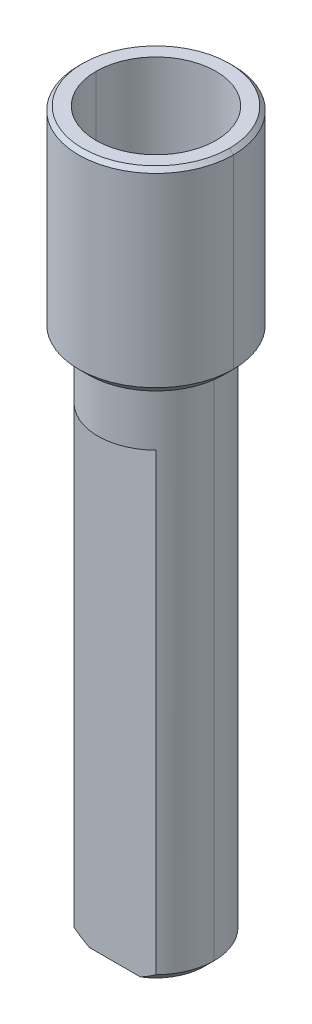
ISO-10303-21;
HEADER;
FILE_DESCRIPTION(('STEP AP214'),'2;1');
FILE_NAME('part.step','',(''),(''),'','','');
FILE_SCHEMA(('AUTOMOTIVE_DESIGN { 1 0 10303 214 1 1 1 1 }'));
ENDSEC;
DATA;
#1=APPLICATION_CONTEXT('core data for automotive mechanical design processes');
#2=APPLICATION_PROTOCOL_DEFINITION('international standard','automotive_design',2000,#1);
#3=PRODUCT_CONTEXT('',#1,'mechanical');
#4=PRODUCT('Part','Part','',(#3));
#5=PRODUCT_RELATED_PRODUCT_CATEGORY('part','',(#4));
#6=PRODUCT_DEFINITION_FORMATION('','',#4);
#7=PRODUCT_DEFINITION_CONTEXT('part definition',#1,'design');
#8=PRODUCT_DEFINITION('design','',#6,#7);
#9=PRODUCT_DEFINITION_SHAPE('','',#8);
#10=(LENGTH_UNIT() NAMED_UNIT(*) SI_UNIT(.MILLI.,.METRE.));
#11=(NAMED_UNIT(*) PLANE_ANGLE_UNIT() SI_UNIT($,.RADIAN.));
#12=(NAMED_UNIT(*) SI_UNIT($,.STERADIAN.) SOLID_ANGLE_UNIT());
#13=UNCERTAINTY_MEASURE_WITH_UNIT(LENGTH_MEASURE(1.E-05),#10,'distance_accuracy_value','');
#14=(GEOMETRIC_REPRESENTATION_CONTEXT(3) GLOBAL_UNCERTAINTY_ASSIGNED_CONTEXT((#13)) GLOBAL_UNIT_ASSIGNED_CONTEXT((#10,
#11,#12)) REPRESENTATION_CONTEXT('',''));
#15=CARTESIAN_POINT('',(0.,0.,0.));
#16=DIRECTION('',(0.,0.,1.));
#17=DIRECTION('',(1.,0.,0.));
#18=AXIS2_PLACEMENT_3D('',#15,#16,#17);
#19=CARTESIAN_POINT('',(0.,10.3,0.));
#20=DIRECTION('',(0.,-1.,0.));
#21=DIRECTION('',(0.,0.,-1.));
#22=AXIS2_PLACEMENT_3D('',#19,#20,#21);
#23=PLANE('',#22);
#24=CARTESIAN_POINT('',(0.,10.3,0.));
#25=DIRECTION('',(0.,-1.,0.));
#26=DIRECTION('',(0.,0.,-1.));
#27=AXIS2_PLACEMENT_3D('',#24,#25,#26);
#28=CIRCLE('',#27,3.1);
#29=CARTESIAN_POINT('',(-3.1,10.3,0.));
#30=VERTEX_POINT('',#29);
#31=CARTESIAN_POINT('',(3.1,10.3,0.));
#32=VERTEX_POINT('',#31);
#33=EDGE_CURVE('E115',#30,#32,#28,.T.);
#34=ORIENTED_EDGE('',*,*,#33,.T.);
#35=CARTESIAN_POINT('',(0.,10.3,0.));
#36=DIRECTION('',(0.,-1.,0.));
#37=DIRECTION('',(0.,0.,-1.));
#38=AXIS2_PLACEMENT_3D('',#35,#36,#37);
#39=CIRCLE('',#38,3.1);
#40=EDGE_CURVE('E20',#32,#30,#39,.T.);
#41=ORIENTED_EDGE('',*,*,#40,.T.);
#42=EDGE_LOOP('',(#34,#41));
#43=FACE_BOUND('',#42,.T.);
#44=CARTESIAN_POINT('',(0.,10.2999999999724,0.));
#45=DIRECTION('',(0.,-1.,0.));
#46=DIRECTION('',(0.,0.,-1.));
#47=AXIS2_PLACEMENT_3D('',#44,#45,#46);
#48=CIRCLE('',#47,3.80000000001246);
#49=CARTESIAN_POINT('',(3.80000000001247,10.2999999999724,0.));
#50=VERTEX_POINT('',#49);
#51=CARTESIAN_POINT('',(-3.80000000001245,10.2999999999724,0.));
#52=VERTEX_POINT('',#51);
#53=EDGE_CURVE('E137',#50,#52,#48,.T.);
#54=ORIENTED_EDGE('',*,*,#53,.F.);
#55=CARTESIAN_POINT('',(0.,10.2999999999724,0.));
#56=DIRECTION('',(0.,-1.,0.));
#57=DIRECTION('',(0.,0.,-1.));
#58=AXIS2_PLACEMENT_3D('',#55,#56,#57);
#59=CIRCLE('',#58,3.80000000001246);
#60=EDGE_CURVE('E132',#52,#50,#59,.T.);
#61=ORIENTED_EDGE('',*,*,#60,.F.);
#62=EDGE_LOOP('',(#54,#61));
#63=FACE_BOUND('',#62,.T.);
#64=ADVANCED_FACE('F17',(#43,#63),#23,.F.);
#65=CARTESIAN_POINT('',(0.,12.165,0.));
#66=DIRECTION('',(0.,-1.,0.));
#67=DIRECTION('',(0.,0.,-1.));
#68=AXIS2_PLACEMENT_3D('',#65,#66,#67);
#69=CYLINDRICAL_SURFACE('',#68,3.1);
#70=DIRECTION('',(0.,-1.,0.));
#71=VECTOR('',#70,1.);
#72=CARTESIAN_POINT('',(3.1,12.165,0.));
#73=LINE('',#72,#71);
#74=CARTESIAN_POINT('',(3.1,2.3,0.));
#75=VERTEX_POINT('',#74);
#76=EDGE_CURVE('E131',#32,#75,#73,.T.);
#77=ORIENTED_EDGE('',*,*,#76,.T.);
#78=CARTESIAN_POINT('',(0.,2.3,0.));
#79=DIRECTION('',(0.,-1.,0.));
#80=DIRECTION('',(0.,0.,-1.));
#81=AXIS2_PLACEMENT_3D('',#78,#79,#80);
#82=CIRCLE('',#81,3.1);
#83=CARTESIAN_POINT('',(-3.1,2.3,0.));
#84=VERTEX_POINT('',#83);
#85=EDGE_CURVE('E125',#75,#84,#82,.T.);
#86=ORIENTED_EDGE('',*,*,#85,.T.);
#87=DIRECTION('',(0.,-1.,0.));
#88=VECTOR('',#87,1.);
#89=CARTESIAN_POINT('',(-3.1,12.165,0.));
#90=LINE('',#89,#88);
#91=EDGE_CURVE('E121',#84,#30,#90,.F.);
#92=ORIENTED_EDGE('',*,*,#91,.T.);
#93=ORIENTED_EDGE('',*,*,#40,.F.);
#94=EDGE_LOOP('',(#77,#86,#92,#93));
#95=FACE_BOUND('',#94,.T.);
#96=ADVANCED_FACE('F123',(#95),#69,.F.);
#97=CARTESIAN_POINT('',(0.,12.165,0.));
#98=DIRECTION('',(0.,-1.,0.));
#99=DIRECTION('',(0.,0.,-1.));
#100=AXIS2_PLACEMENT_3D('',#97,#98,#99);
#101=CYLINDRICAL_SURFACE('',#100,3.1);
#102=ORIENTED_EDGE('',*,*,#76,.F.);
#103=ORIENTED_EDGE('',*,*,#33,.F.);
#104=ORIENTED_EDGE('',*,*,#91,.F.);
#105=CARTESIAN_POINT('',(0.,2.3,0.));
#106=DIRECTION('',(0.,-1.,0.));
#107=DIRECTION('',(0.,0.,-1.));
#108=AXIS2_PLACEMENT_3D('',#105,#106,#107);
#109=CIRCLE('',#108,3.1);
#110=EDGE_CURVE('E142',#84,#75,#109,.T.);
#111=ORIENTED_EDGE('',*,*,#110,.T.);
#112=EDGE_LOOP('',(#102,#103,#104,#111));
#113=FACE_BOUND('',#112,.T.);
#114=ADVANCED_FACE('F130',(#113),#101,.F.);
#115=CARTESIAN_POINT('',(0.,10.1000000000795,0.));
#116=DIRECTION('',(0.,-1.,0.));
#117=DIRECTION('',(0.,0.,-1.));
#118=AXIS2_PLACEMENT_3D('',#115,#116,#117);
#119=CONICAL_SURFACE('',#118,3.99999999990542,0.785398163397448);
#120=DIRECTION('',(-0.707106781186443,0.707106781186652,0.));
#121=VECTOR('',#120,1.);
#122=CARTESIAN_POINT('',(499000.,-498985.900000148,-3.05539285278683E-11));
#123=LINE('',#122,#121);
#124=CARTESIAN_POINT('',(3.99999999999056,10.1000000000057,0.));
#125=VERTEX_POINT('',#124);
#126=EDGE_CURVE('E136',#125,#50,#123,.T.);
#127=ORIENTED_EDGE('',*,*,#126,.F.);
#128=CARTESIAN_POINT('',(0.,10.1,0.));
#129=DIRECTION('',(0.,-1.,0.));
#130=DIRECTION('',(0.,0.,-1.));
#131=AXIS2_PLACEMENT_3D('',#128,#129,#130);
#132=CIRCLE('',#131,4.);
#133=CARTESIAN_POINT('',(-3.99999999999056,10.1000000000057,0.));
#134=VERTEX_POINT('',#133);
#135=EDGE_CURVE('E144',#134,#125,#132,.T.);
#136=ORIENTED_EDGE('',*,*,#135,.F.);
#137=DIRECTION('',(0.707106781186443,0.707106781186652,0.));
#138=VECTOR('',#137,1.);
#139=CARTESIAN_POINT('',(-499000.,-498985.900000148,9.16617855836049E-11));
#140=LINE('',#139,#138);
#141=EDGE_CURVE('E140',#52,#134,#140,.F.);
#142=ORIENTED_EDGE('',*,*,#141,.F.);
#143=ORIENTED_EDGE('',*,*,#60,.T.);
#144=EDGE_LOOP('',(#127,#136,#142,#143));
#145=FACE_BOUND('',#144,.T.);
#146=ADVANCED_FACE('F510',(#145),#119,.T.);
#147=CARTESIAN_POINT('',(0.,10.1000000000795,0.));
#148=DIRECTION('',(0.,-1.,0.));
#149=DIRECTION('',(0.,0.,-1.));
#150=AXIS2_PLACEMENT_3D('',#147,#148,#149);
#151=CONICAL_SURFACE('',#150,3.99999999990542,0.785398163397448);
#152=ORIENTED_EDGE('',*,*,#141,.T.);
#153=CARTESIAN_POINT('',(0.,10.1,0.));
#154=DIRECTION('',(0.,-1.,0.));
#155=DIRECTION('',(0.,0.,-1.));
#156=AXIS2_PLACEMENT_3D('',#153,#154,#155);
#157=CIRCLE('',#156,4.);
#158=EDGE_CURVE('E148',#125,#134,#157,.T.);
#159=ORIENTED_EDGE('',*,*,#158,.F.);
#160=ORIENTED_EDGE('',*,*,#126,.T.);
#161=ORIENTED_EDGE('',*,*,#53,.T.);
#162=EDGE_LOOP('',(#152,#159,#160,#161));
#163=FACE_BOUND('',#162,.T.);
#164=ADVANCED_FACE('F300',(#163),#151,.T.);
#165=CARTESIAN_POINT('',(0.,2.3,0.));
#166=DIRECTION('',(0.,-1.,0.));
#167=DIRECTION('',(0.,0.,-1.));
#168=AXIS2_PLACEMENT_3D('',#165,#166,#167);
#169=PLANE('',#168);
#170=CARTESIAN_POINT('',(0.,2.3,0.));
#171=DIRECTION('',(0.,-1.,0.));
#172=DIRECTION('',(0.,0.,-1.));
#173=AXIS2_PLACEMENT_3D('',#170,#171,#172);
#174=CIRCLE('',#173,1.15);
#175=CARTESIAN_POINT('',(-1.15,2.3,0.));
#176=VERTEX_POINT('',#175);
#177=CARTESIAN_POINT('',(1.15,2.3,0.));
#178=VERTEX_POINT('',#177);
#179=EDGE_CURVE('E145',#176,#178,#174,.T.);
#180=ORIENTED_EDGE('',*,*,#179,.T.);
#181=CARTESIAN_POINT('',(0.,2.3,0.));
#182=DIRECTION('',(0.,-1.,0.));
#183=DIRECTION('',(0.,0.,-1.));
#184=AXIS2_PLACEMENT_3D('',#181,#182,#183);
#185=CIRCLE('',#184,1.15);
#186=EDGE_CURVE('E149',#178,#176,#185,.T.);
#187=ORIENTED_EDGE('',*,*,#186,.T.);
#188=EDGE_LOOP('',(#180,#187));
#189=FACE_BOUND('',#188,.T.);
#190=ORIENTED_EDGE('',*,*,#85,.F.);
#191=ORIENTED_EDGE('',*,*,#110,.F.);
#192=EDGE_LOOP('',(#190,#191));
#193=FACE_BOUND('',#192,.T.);
#194=ADVANCED_FACE('F494',(#189,#193),#169,.F.);
#195=CARTESIAN_POINT('',(0.,12.165,0.));
#196=DIRECTION('',(0.,-1.,0.));
#197=DIRECTION('',(0.,0.,-1.));
#198=AXIS2_PLACEMENT_3D('',#195,#196,#197);
#199=CYLINDRICAL_SURFACE('',#198,4.);
#200=DIRECTION('',(0.,-1.,0.));
#201=VECTOR('',#200,1.);
#202=CARTESIAN_POINT('',(-4.,12.165,0.));
#203=LINE('',#202,#201);
#204=CARTESIAN_POINT('',(-4.00000000001433,0.4999999999485,0.));
#205=VERTEX_POINT('',#204);
#206=EDGE_CURVE('E272',#134,#205,#203,.T.);
#207=ORIENTED_EDGE('',*,*,#206,.F.);
#208=ORIENTED_EDGE('',*,*,#135,.T.);
#209=DIRECTION('',(0.,-1.,0.));
#210=VECTOR('',#209,1.);
#211=CARTESIAN_POINT('',(4.,12.165,0.));
#212=LINE('',#211,#210);
#213=CARTESIAN_POINT('',(4.00000000001433,0.499999999931333,0.));
#214=VERTEX_POINT('',#213);
#215=EDGE_CURVE('E275',#214,#125,#212,.F.);
#216=ORIENTED_EDGE('',*,*,#215,.F.);
#217=CARTESIAN_POINT('',(0.,0.499999999931333,0.));
#218=DIRECTION('',(0.,1.,0.));
#219=DIRECTION('',(0.,0.,-1.));
#220=AXIS2_PLACEMENT_3D('',#217,#218,#219);
#221=CIRCLE('',#220,4.0000000000191);
#222=EDGE_CURVE('E152',#205,#214,#221,.F.);
#223=ORIENTED_EDGE('',*,*,#222,.F.);
#224=EDGE_LOOP('',(#207,#208,#216,#223));
#225=FACE_BOUND('',#224,.T.);
#226=ADVANCED_FACE('F314',(#225),#199,.T.);
#227=CARTESIAN_POINT('',(0.,12.165,0.));
#228=DIRECTION('',(0.,-1.,0.));
#229=DIRECTION('',(0.,0.,-1.));
#230=AXIS2_PLACEMENT_3D('',#227,#228,#229);
#231=CYLINDRICAL_SURFACE('',#230,4.);
#232=ORIENTED_EDGE('',*,*,#215,.T.);
#233=ORIENTED_EDGE('',*,*,#158,.T.);
#234=ORIENTED_EDGE('',*,*,#206,.T.);
#235=CARTESIAN_POINT('',(0.,0.499999999931333,0.));
#236=DIRECTION('',(0.,1.,0.));
#237=DIRECTION('',(0.,0.,-1.));
#238=AXIS2_PLACEMENT_3D('',#235,#236,#237);
#239=CIRCLE('',#238,4.0000000000191);
#240=EDGE_CURVE('E253',#214,#205,#239,.F.);
#241=ORIENTED_EDGE('',*,*,#240,.F.);
#242=EDGE_LOOP('',(#232,#233,#234,#241));
#243=FACE_BOUND('',#242,.T.);
#244=ADVANCED_FACE('F306',(#243),#231,.T.);
#245=CARTESIAN_POINT('',(0.,12.165,0.));
#246=DIRECTION('',(0.,-1.,0.));
#247=DIRECTION('',(0.,0.,-1.));
#248=AXIS2_PLACEMENT_3D('',#245,#246,#247);
#249=CYLINDRICAL_SURFACE('',#248,1.15);
#250=DIRECTION('',(0.,-1.,0.));
#251=VECTOR('',#250,1.);
#252=CARTESIAN_POINT('',(1.15,12.165,0.));
#253=LINE('',#252,#251);
#254=CARTESIAN_POINT('',(1.15,-27.,0.));
#255=VERTEX_POINT('',#254);
#256=EDGE_CURVE('E153',#255,#178,#253,.F.);
#257=ORIENTED_EDGE('',*,*,#256,.T.);
#258=ORIENTED_EDGE('',*,*,#179,.F.);
#259=DIRECTION('',(0.,-1.,0.));
#260=VECTOR('',#259,1.);
#261=CARTESIAN_POINT('',(-1.15,12.165,0.));
#262=LINE('',#261,#260);
#263=CARTESIAN_POINT('',(-1.15,-27.,0.));
#264=VERTEX_POINT('',#263);
#265=EDGE_CURVE('E147',#176,#264,#262,.T.);
#266=ORIENTED_EDGE('',*,*,#265,.T.);
#267=CARTESIAN_POINT('',(0.,-27.,0.));
#268=DIRECTION('',(0.,-1.,0.));
#269=DIRECTION('',(0.,0.,-1.));
#270=AXIS2_PLACEMENT_3D('',#267,#268,#269);
#271=CIRCLE('',#270,1.15);
#272=EDGE_CURVE('E163',#255,#264,#271,.F.);
#273=ORIENTED_EDGE('',*,*,#272,.F.);
#274=EDGE_LOOP('',(#257,#258,#266,#273));
#275=FACE_BOUND('',#274,.T.);
#276=ADVANCED_FACE('F470',(#275),#249,.F.);
#277=CARTESIAN_POINT('',(0.,12.165,0.));
#278=DIRECTION('',(0.,-1.,0.));
#279=DIRECTION('',(0.,0.,-1.));
#280=AXIS2_PLACEMENT_3D('',#277,#278,#279);
#281=CYLINDRICAL_SURFACE('',#280,1.15);
#282=ORIENTED_EDGE('',*,*,#256,.F.);
#283=CARTESIAN_POINT('',(0.,-27.,0.));
#284=DIRECTION('',(0.,-1.,0.));
#285=DIRECTION('',(0.,0.,-1.));
#286=AXIS2_PLACEMENT_3D('',#283,#284,#285);
#287=CIRCLE('',#286,1.15);
#288=EDGE_CURVE('E361',#264,#255,#287,.F.);
#289=ORIENTED_EDGE('',*,*,#288,.F.);
#290=ORIENTED_EDGE('',*,*,#265,.F.);
#291=ORIENTED_EDGE('',*,*,#186,.F.);
#292=EDGE_LOOP('',(#282,#289,#290,#291));
#293=FACE_BOUND('',#292,.T.);
#294=ADVANCED_FACE('F462',(#293),#281,.F.);
#295=CARTESIAN_POINT('',(0.,0.499999999931333,0.));
#296=DIRECTION('',(0.,1.,0.));
#297=DIRECTION('',(0.,0.,1.));
#298=AXIS2_PLACEMENT_3D('',#295,#296,#297);
#299=CONICAL_SURFACE('',#298,4.0000000000191,0.785398163397448);
#300=DIRECTION('',(-0.707106781186443,-0.707106781186652,0.));
#301=VECTOR('',#300,1.);
#302=CARTESIAN_POINT('',(499000.,498996.500000148,9.16617855836049E-11));
#303=LINE('',#302,#301);
#304=CARTESIAN_POINT('',(3.50000000003093,-5.6843418860808E-11,0.));
#305=VERTEX_POINT('',#304);
#306=EDGE_CURVE('E256',#305,#214,#303,.F.);
#307=ORIENTED_EDGE('',*,*,#306,.F.);
#308=CARTESIAN_POINT('',(0.,-5.6843418860808E-11,0.));
#309=DIRECTION('',(0.,1.,0.));
#310=DIRECTION('',(0.,0.,1.));
#311=AXIS2_PLACEMENT_3D('',#308,#309,#310);
#312=CIRCLE('',#311,3.50000000003093);
#313=CARTESIAN_POINT('',(-3.50000000003093,-5.6843418860808E-11,0.));
#314=VERTEX_POINT('',#313);
#315=EDGE_CURVE('E320',#314,#305,#312,.F.);
#316=ORIENTED_EDGE('',*,*,#315,.F.);
#317=DIRECTION('',(0.707106781186443,-0.707106781186652,0.));
#318=VECTOR('',#317,1.);
#319=CARTESIAN_POINT('',(-499000.,498996.500000148,-3.05539285278683E-11));
#320=LINE('',#319,#318);
#321=EDGE_CURVE('E162',#205,#314,#320,.T.);
#322=ORIENTED_EDGE('',*,*,#321,.F.);
#323=ORIENTED_EDGE('',*,*,#222,.T.);
#324=EDGE_LOOP('',(#307,#316,#322,#323));
#325=FACE_BOUND('',#324,.T.);
#326=ADVANCED_FACE('F317',(#325),#299,.T.);
#327=CARTESIAN_POINT('',(0.,0.499999999931333,0.));
#328=DIRECTION('',(0.,1.,0.));
#329=DIRECTION('',(0.,0.,1.));
#330=AXIS2_PLACEMENT_3D('',#327,#328,#329);
#331=CONICAL_SURFACE('',#330,4.0000000000191,0.785398163397448);
#332=ORIENTED_EDGE('',*,*,#321,.T.);
#333=CARTESIAN_POINT('',(0.,-5.6843418860808E-11,0.));
#334=DIRECTION('',(0.,1.,0.));
#335=DIRECTION('',(0.,0.,1.));
#336=AXIS2_PLACEMENT_3D('',#333,#334,#335);
#337=CIRCLE('',#336,3.50000000003093);
#338=EDGE_CURVE('E325',#305,#314,#337,.F.);
#339=ORIENTED_EDGE('',*,*,#338,.F.);
#340=ORIENTED_EDGE('',*,*,#306,.T.);
#341=ORIENTED_EDGE('',*,*,#240,.T.);
#342=EDGE_LOOP('',(#332,#339,#340,#341));
#343=FACE_BOUND('',#342,.T.);
#344=ADVANCED_FACE('F324',(#343),#331,.T.);
#345=CARTESIAN_POINT('',(0.,-3.,0.));
#346=DIRECTION('',(0.,-1.,0.));
#347=DIRECTION('',(0.,0.,-1.));
#348=AXIS2_PLACEMENT_3D('',#345,#346,#347);
#349=PLANE('',#348);
#350=DIRECTION('',(1.,0.,0.));
#351=VECTOR('',#350,1.);
#352=CARTESIAN_POINT('',(2.117634293262,-3.,-2.125));
#353=LINE('',#352,#351);
#354=CARTESIAN_POINT('',(2.11763429326213,-3.,-2.12500000000005));
#355=VERTEX_POINT('',#354);
#356=CARTESIAN_POINT('',(-2.11763429326213,-3.,-2.12500000000005));
#357=VERTEX_POINT('',#356);
#358=EDGE_CURVE('E161',#355,#357,#353,.F.);
#359=ORIENTED_EDGE('',*,*,#358,.T.);
#360=CARTESIAN_POINT('',(0.,-3.,0.));
#361=DIRECTION('',(0.,-1.,0.));
#362=DIRECTION('',(0.,0.,-1.));
#363=AXIS2_PLACEMENT_3D('',#360,#361,#362);
#364=CIRCLE('',#363,3.);
#365=EDGE_CURVE('E247',#355,#357,#364,.F.);
#366=ORIENTED_EDGE('',*,*,#365,.F.);
#367=EDGE_LOOP('',(#359,#366));
#368=FACE_BOUND('',#367,.T.);
#369=ADVANCED_FACE('F349',(#368),#349,.T.);
#370=CARTESIAN_POINT('',(2.117634293262,-27.,-2.125));
#371=DIRECTION('',(0.,0.,1.));
#372=DIRECTION('',(1.,0.,0.));
#373=AXIS2_PLACEMENT_3D('',#370,#371,#372);
#374=PLANE('',#373);
#375=ORIENTED_EDGE('',*,*,#358,.F.);
#376=DIRECTION('',(0.,-1.,0.));
#377=VECTOR('',#376,1.);
#378=CARTESIAN_POINT('',(2.11763429326209,12.165,-2.12500000000009));
#379=LINE('',#378,#377);
#380=CARTESIAN_POINT('',(2.1176342932577,-26.4999999999954,-2.12500000000005));
#381=VERTEX_POINT('',#380);
#382=EDGE_CURVE('E237',#381,#355,#379,.F.);
#383=ORIENTED_EDGE('',*,*,#382,.F.);
#384=CARTESIAN_POINT('',(1.31695671908355,-26.9999999999398,-2.125));
#385=CARTESIAN_POINT('',(1.38665153783094,-26.9632588853921,-2.125));
#386=CARTESIAN_POINT('',(1.45547755114095,-26.9249242030122,-2.125));
#387=CARTESIAN_POINT('',(1.59153025188495,-26.8456631509061,-2.125));
#388=CARTESIAN_POINT('',(1.65875851235902,-26.8047394890005,-2.125));
#389=CARTESIAN_POINT('',(1.79187746446695,-26.7208300709876,-2.125));
#390=CARTESIAN_POINT('',(1.85776853475894,-26.6778449105754,-2.125));
#391=CARTESIAN_POINT('',(1.98847891203568,-26.5901293157651,-2.125));
#392=CARTESIAN_POINT('',(2.05329704892092,-26.5453971344437,-2.125));
#393=CARTESIAN_POINT('',(2.11763429325332,-26.4999999999908,-2.125));
#394=B_SPLINE_CURVE_WITH_KNOTS('',3,(#384,#385,#386,#387,#388,#389,#390,#391,#392,#393),
.UNSPECIFIED.,.F.,.F.,(4,2,2,2,4),(0.,0.23630156388161,0.47235993948294,0.708350509375656,
0.944583422299106),.UNSPECIFIED.);
#395=CARTESIAN_POINT('',(1.31695671903581,-26.999999999965,-2.125));
#396=VERTEX_POINT('',#395);
#397=EDGE_CURVE('E329',#396,#381,#394,.T.);
#398=ORIENTED_EDGE('',*,*,#397,.F.);
#399=DIRECTION('',(1.,0.,0.));
#400=VECTOR('',#399,1.);
#401=CARTESIAN_POINT('',(0.,-27.,-2.125));
#402=LINE('',#401,#400);
#403=CARTESIAN_POINT('',(-1.31695671909248,-26.9999999999351,-2.125));
#404=VERTEX_POINT('',#403);
#405=EDGE_CURVE('E241',#404,#396,#402,.T.);
#406=ORIENTED_EDGE('',*,*,#405,.F.);
#407=CARTESIAN_POINT('',(-2.11763429325347,-26.4999999999907,-2.125));
#408=CARTESIAN_POINT('',(-2.05329704892099,-26.5453971344437,-2.125));
#409=CARTESIAN_POINT('',(-1.98847891203567,-26.5901293157651,-2.125));
#410=CARTESIAN_POINT('',(-1.85776853475877,-26.6778449105755,-2.125));
#411=CARTESIAN_POINT('',(-1.79187746446669,-26.7208300709878,-2.125));
#412=CARTESIAN_POINT('',(-1.6587585123586,-26.8047394890008,-2.125));
#413=CARTESIAN_POINT('',(-1.59153025188445,-26.8456631509064,-2.125));
#414=CARTESIAN_POINT('',(-1.45547755114027,-26.9249242030126,-2.125));
#415=CARTESIAN_POINT('',(-1.38665153783016,-26.9632588853925,-2.125));
#416=CARTESIAN_POINT('',(-1.31695671908267,-26.9999999999403,-2.125));
#417=B_SPLINE_CURVE_WITH_KNOTS('',3,(#407,#408,#409,#410,#411,#412,#413,#414,#415,#416),
.UNSPECIFIED.,.F.,.F.,(4,2,2,2,4),(0.,0.236232912923744,0.472223482816749,0.708281858418368,
0.944583422300273),.UNSPECIFIED.);
#418=CARTESIAN_POINT('',(-2.11763429325778,-26.4999999999947,-2.12500000000005));
#419=VERTEX_POINT('',#418);
#420=EDGE_CURVE('E154',#419,#404,#417,.T.);
#421=ORIENTED_EDGE('',*,*,#420,.F.);
#422=DIRECTION('',(0.,-1.,0.));
#423=VECTOR('',#422,1.);
#424=CARTESIAN_POINT('',(-2.11763429326209,12.165,-2.12500000000009));
#425=LINE('',#424,#423);
#426=EDGE_CURVE('E243',#357,#419,#425,.T.);
#427=ORIENTED_EDGE('',*,*,#426,.F.);
#428=EDGE_LOOP('',(#375,#383,#398,#406,#421,#427));
#429=FACE_BOUND('',#428,.T.);
#430=ADVANCED_FACE('F165',(#429),#374,.F.);
#431=CARTESIAN_POINT('',(0.,-27.,0.));
#432=DIRECTION('',(0.,-1.,0.));
#433=DIRECTION('',(0.,0.,-1.));
#434=AXIS2_PLACEMENT_3D('',#431,#432,#433);
#435=PLANE('',#434);
#436=ORIENTED_EDGE('',*,*,#272,.T.);
#437=ORIENTED_EDGE('',*,*,#288,.T.);
#438=EDGE_LOOP('',(#436,#437));
#439=FACE_BOUND('',#438,.T.);
#440=CARTESIAN_POINT('',(0.,-26.9999999999299,0.));
#441=DIRECTION('',(0.,1.,0.));
#442=DIRECTION('',(0.,0.,1.));
#443=AXIS2_PLACEMENT_3D('',#440,#441,#442);
#444=CIRCLE('',#443,2.49999999999772);
#445=CARTESIAN_POINT('',(1.31695671909247,-26.9999999999351,2.125));
#446=VERTEX_POINT('',#445);
#447=EDGE_CURVE('E331',#446,#396,#444,.T.);
#448=ORIENTED_EDGE('',*,*,#447,.F.);
#449=DIRECTION('',(-1.,0.,0.));
#450=VECTOR('',#449,1.);
#451=CARTESIAN_POINT('',(-2.117634293262,-27.,2.125));
#452=LINE('',#451,#450);
#453=CARTESIAN_POINT('',(-1.31695671903582,-26.999999999965,2.125));
#454=VERTEX_POINT('',#453);
#455=EDGE_CURVE('E187',#446,#454,#452,.T.);
#456=ORIENTED_EDGE('',*,*,#455,.T.);
#457=CARTESIAN_POINT('',(0.,-26.9999999999299,0.));
#458=DIRECTION('',(0.,1.,0.));
#459=DIRECTION('',(0.,0.,1.));
#460=AXIS2_PLACEMENT_3D('',#457,#458,#459);
#461=CIRCLE('',#460,2.49999999999772);
#462=EDGE_CURVE('E194',#404,#454,#461,.T.);
#463=ORIENTED_EDGE('',*,*,#462,.F.);
#464=ORIENTED_EDGE('',*,*,#405,.T.);
#465=EDGE_LOOP('',(#448,#456,#463,#464));
#466=FACE_BOUND('',#465,.T.);
#467=ADVANCED_FACE('F341',(#439,#466),#435,.T.);
#468=CARTESIAN_POINT('',(0.,-26.5000000000555,0.));
#469=DIRECTION('',(0.,1.,0.));
#470=DIRECTION('',(0.,0.,1.));
#471=AXIS2_PLACEMENT_3D('',#468,#469,#470);
#472=CONICAL_SURFACE('',#471,2.99999999992906,0.785398163454292);
#473=CARTESIAN_POINT('',(0.,-26.5,0.));
#474=DIRECTION('',(0.,-1.,0.));
#475=DIRECTION('',(0.,0.,-1.));
#476=AXIS2_PLACEMENT_3D('',#473,#474,#475);
#477=CIRCLE('',#476,3.);
#478=CARTESIAN_POINT('',(3.,-26.5,-1.05001058303862E-12));
#479=VERTEX_POINT('',#478);
#480=EDGE_CURVE('E234',#479,#381,#477,.F.);
#481=ORIENTED_EDGE('',*,*,#480,.F.);
#482=CARTESIAN_POINT('',(0.,-26.5,0.));
#483=DIRECTION('',(0.,-1.,0.));
#484=DIRECTION('',(0.,0.,-1.));
#485=AXIS2_PLACEMENT_3D('',#482,#483,#484);
#486=CIRCLE('',#485,3.);
#487=CARTESIAN_POINT('',(2.11763429325849,-26.4999999999949,2.125));
#488=VERTEX_POINT('',#487);
#489=EDGE_CURVE('E225',#488,#479,#486,.F.);
#490=ORIENTED_EDGE('',*,*,#489,.F.);
#491=CARTESIAN_POINT('',(2.1176342932548,-26.4999999999898,2.125));
#492=CARTESIAN_POINT('',(2.05329704892222,-26.5453971344428,2.125));
#493=CARTESIAN_POINT('',(1.9884789120368,-26.5901293157643,2.125));
#494=CARTESIAN_POINT('',(1.85776853475968,-26.6778449105749,2.125));
#495=CARTESIAN_POINT('',(1.79187746446749,-26.7208300709873,2.125));
#496=CARTESIAN_POINT('',(1.65875851235918,-26.8047394890004,2.125));
#497=CARTESIAN_POINT('',(1.59153025188491,-26.8456631509062,2.125));
#498=CARTESIAN_POINT('',(1.4554775511405,-26.9249242030124,2.125));
#499=CARTESIAN_POINT('',(1.38665153783028,-26.9632588853925,2.125));
#500=CARTESIAN_POINT('',(1.31695671908267,-26.9999999999403,2.125));
#501=B_SPLINE_CURVE_WITH_KNOTS('',3,(#491,#492,#493,#494,#495,#496,#497,#498,#499,#500),
.UNSPECIFIED.,.F.,.F.,(4,2,2,2,4),(0.,0.236232912924154,0.472223482817569,0.7082818584196,
0.944583422301915),.UNSPECIFIED.);
#502=EDGE_CURVE('E188',#488,#446,#501,.T.);
#503=ORIENTED_EDGE('',*,*,#502,.T.);
#504=ORIENTED_EDGE('',*,*,#447,.T.);
#505=ORIENTED_EDGE('',*,*,#397,.T.);
#506=EDGE_LOOP('',(#481,#490,#503,#504,#505));
#507=FACE_BOUND('',#506,.T.);
#508=ADVANCED_FACE('F338',(#507),#472,.T.);
#509=CARTESIAN_POINT('',(0.,0.,0.));
#510=DIRECTION('',(0.,-1.,0.));
#511=DIRECTION('',(0.,0.,-1.));
#512=AXIS2_PLACEMENT_3D('',#509,#510,#511);
#513=PLANE('',#512);
#514=CARTESIAN_POINT('',(0.,0.,0.));
#515=DIRECTION('',(0.,-1.,0.));
#516=DIRECTION('',(0.,0.,-1.));
#517=AXIS2_PLACEMENT_3D('',#514,#515,#516);
#518=CIRCLE('',#517,3.);
#519=CARTESIAN_POINT('',(-3.,0.,0.));
#520=VERTEX_POINT('',#519);
#521=CARTESIAN_POINT('',(3.,0.,-5.25464518901994E-13));
#522=VERTEX_POINT('',#521);
#523=EDGE_CURVE('E238',#520,#522,#518,.T.);
#524=ORIENTED_EDGE('',*,*,#523,.F.);
#525=CARTESIAN_POINT('',(0.,0.,0.));
#526=DIRECTION('',(0.,-1.,0.));
#527=DIRECTION('',(0.,0.,-1.));
#528=AXIS2_PLACEMENT_3D('',#525,#526,#527);
#529=CIRCLE('',#528,3.);
#530=EDGE_CURVE('E217',#522,#520,#529,.T.);
#531=ORIENTED_EDGE('',*,*,#530,.F.);
#532=EDGE_LOOP('',(#524,#531));
#533=FACE_BOUND('',#532,.T.);
#534=ORIENTED_EDGE('',*,*,#315,.T.);
#535=ORIENTED_EDGE('',*,*,#338,.T.);
#536=EDGE_LOOP('',(#534,#535));
#537=FACE_BOUND('',#536,.T.);
#538=ADVANCED_FACE('F328',(#533,#537),#513,.T.);
#539=CARTESIAN_POINT('',(0.,12.165,0.));
#540=DIRECTION('',(0.,-1.,0.));
#541=DIRECTION('',(0.,0.,-1.));
#542=AXIS2_PLACEMENT_3D('',#539,#540,#541);
#543=CYLINDRICAL_SURFACE('',#542,3.);
#544=ORIENTED_EDGE('',*,*,#426,.T.);
#545=CARTESIAN_POINT('',(0.,-26.4999999999987,0.));
#546=DIRECTION('',(0.,1.,0.));
#547=DIRECTION('',(0.,0.,-1.));
#548=AXIS2_PLACEMENT_3D('',#545,#546,#547);
#549=CIRCLE('',#548,2.99999999998591);
#550=CARTESIAN_POINT('',(-2.99999999999531,-26.4999999999996,0.));
#551=VERTEX_POINT('',#550);
#552=EDGE_CURVE('E246',#551,#419,#549,.F.);
#553=ORIENTED_EDGE('',*,*,#552,.F.);
#554=DIRECTION('',(0.,-1.,0.));
#555=VECTOR('',#554,1.);
#556=CARTESIAN_POINT('',(-3.,12.165,0.));
#557=LINE('',#556,#555);
#558=EDGE_CURVE('E219',#520,#551,#557,.T.);
#559=ORIENTED_EDGE('',*,*,#558,.F.);
#560=ORIENTED_EDGE('',*,*,#523,.T.);
#561=DIRECTION('',(0.,-1.,0.));
#562=VECTOR('',#561,1.);
#563=CARTESIAN_POINT('',(3.,12.165,-1.05001058303862E-12));
#564=LINE('',#563,#562);
#565=EDGE_CURVE('E220',#479,#522,#564,.F.);
#566=ORIENTED_EDGE('',*,*,#565,.F.);
#567=ORIENTED_EDGE('',*,*,#480,.T.);
#568=ORIENTED_EDGE('',*,*,#382,.T.);
#569=ORIENTED_EDGE('',*,*,#365,.T.);
#570=EDGE_LOOP('',(#544,#553,#559,#560,#566,#567,#568,#569));
#571=FACE_BOUND('',#570,.T.);
#572=ADVANCED_FACE('F175',(#571),#543,.T.);
#573=CARTESIAN_POINT('',(0.,-26.5000000000555,0.));
#574=DIRECTION('',(0.,1.,0.));
#575=DIRECTION('',(0.,0.,1.));
#576=AXIS2_PLACEMENT_3D('',#573,#574,#575);
#577=CONICAL_SURFACE('',#576,2.99999999992906,0.785398163454292);
#578=ORIENTED_EDGE('',*,*,#420,.T.);
#579=ORIENTED_EDGE('',*,*,#462,.T.);
#580=CARTESIAN_POINT('',(-1.31695671908267,-26.9999999999403,2.125));
#581=CARTESIAN_POINT('',(-1.38665153783028,-26.9632588853925,2.125));
#582=CARTESIAN_POINT('',(-1.45547755114051,-26.9249242030124,2.125));
#583=CARTESIAN_POINT('',(-1.59153025188492,-26.8456631509062,2.125));
#584=CARTESIAN_POINT('',(-1.65875851235919,-26.8047394890004,2.125));
#585=CARTESIAN_POINT('',(-1.7918774644675,-26.7208300709873,2.125));
#586=CARTESIAN_POINT('',(-1.85776853475969,-26.6778449105749,2.125));
#587=CARTESIAN_POINT('',(-1.9884789120368,-26.5901293157643,2.125));
#588=CARTESIAN_POINT('',(-2.05329704892223,-26.5453971344428,2.125));
#589=CARTESIAN_POINT('',(-2.11763429325481,-26.4999999999898,2.125));
#590=B_SPLINE_CURVE_WITH_KNOTS('',3,(#580,#581,#582,#583,#584,#585,#586,#587,#588,#589),
.UNSPECIFIED.,.F.,.F.,(4,2,2,2,4),(0.,0.236301563882316,0.472359939484346,0.708350509377761,
0.944583422301916),.UNSPECIFIED.);
#591=CARTESIAN_POINT('',(-2.11763429325845,-26.4999999999949,2.12500000000005));
#592=VERTEX_POINT('',#591);
#593=EDGE_CURVE('E181',#454,#592,#590,.T.);
#594=ORIENTED_EDGE('',*,*,#593,.T.);
#595=CARTESIAN_POINT('',(0.,-26.5,0.));
#596=DIRECTION('',(0.,-1.,0.));
#597=DIRECTION('',(0.,0.,-1.));
#598=AXIS2_PLACEMENT_3D('',#595,#596,#597);
#599=CIRCLE('',#598,3.);
#600=EDGE_CURVE('E215',#551,#592,#599,.F.);
#601=ORIENTED_EDGE('',*,*,#600,.F.);
#602=ORIENTED_EDGE('',*,*,#552,.T.);
#603=EDGE_LOOP('',(#578,#579,#594,#601,#602));
#604=FACE_BOUND('',#603,.T.);
#605=ADVANCED_FACE('F169',(#604),#577,.T.);
#606=CARTESIAN_POINT('',(0.,-3.,0.));
#607=DIRECTION('',(0.,-1.,0.));
#608=DIRECTION('',(0.,0.,-1.));
#609=AXIS2_PLACEMENT_3D('',#606,#607,#608);
#610=PLANE('',#609);
#611=CARTESIAN_POINT('',(0.,-3.,0.));
#612=DIRECTION('',(0.,-1.,0.));
#613=DIRECTION('',(0.,0.,-1.));
#614=AXIS2_PLACEMENT_3D('',#611,#612,#613);
#615=CIRCLE('',#614,3.);
#616=CARTESIAN_POINT('',(-2.11763429326213,-3.,2.12500000000005));
#617=VERTEX_POINT('',#616);
#618=CARTESIAN_POINT('',(2.11763429326213,-3.,2.12500000000005));
#619=VERTEX_POINT('',#618);
#620=EDGE_CURVE('E26',#617,#619,#615,.F.);
#621=ORIENTED_EDGE('',*,*,#620,.F.);
#622=DIRECTION('',(-1.,0.,0.));
#623=VECTOR('',#622,1.);
#624=CARTESIAN_POINT('',(-2.117634293262,-3.,2.125));
#625=LINE('',#624,#623);
#626=EDGE_CURVE('E34',#617,#619,#625,.F.);
#627=ORIENTED_EDGE('',*,*,#626,.T.);
#628=EDGE_LOOP('',(#621,#627));
#629=FACE_BOUND('',#628,.T.);
#630=ADVANCED_FACE('F174',(#629),#610,.T.);
#631=CARTESIAN_POINT('',(-2.117634293262,-27.,2.125));
#632=DIRECTION('',(0.,0.,-1.));
#633=DIRECTION('',(-1.,0.,0.));
#634=AXIS2_PLACEMENT_3D('',#631,#632,#633);
#635=PLANE('',#634);
#636=DIRECTION('',(0.,-1.,0.));
#637=VECTOR('',#636,1.);
#638=CARTESIAN_POINT('',(2.11763429326209,12.165,2.12500000000009));
#639=LINE('',#638,#637);
#640=EDGE_CURVE('E11',#619,#488,#639,.T.);
#641=ORIENTED_EDGE('',*,*,#640,.F.);
#642=ORIENTED_EDGE('',*,*,#626,.F.);
#643=DIRECTION('',(0.,-1.,0.));
#644=VECTOR('',#643,1.);
#645=CARTESIAN_POINT('',(-2.11763429326209,12.165,2.12500000000009));
#646=LINE('',#645,#644);
#647=EDGE_CURVE('E213',#592,#617,#646,.F.);
#648=ORIENTED_EDGE('',*,*,#647,.F.);
#649=ORIENTED_EDGE('',*,*,#593,.F.);
#650=ORIENTED_EDGE('',*,*,#455,.F.);
#651=ORIENTED_EDGE('',*,*,#502,.F.);
#652=EDGE_LOOP('',(#641,#642,#648,#649,#650,#651));
#653=FACE_BOUND('',#652,.T.);
#654=ADVANCED_FACE('F196',(#653),#635,.F.);
#655=CARTESIAN_POINT('',(0.,12.165,0.));
#656=DIRECTION('',(0.,-1.,0.));
#657=DIRECTION('',(0.,0.,-1.));
#658=AXIS2_PLACEMENT_3D('',#655,#656,#657);
#659=CYLINDRICAL_SURFACE('',#658,3.);
#660=ORIENTED_EDGE('',*,*,#620,.T.);
#661=ORIENTED_EDGE('',*,*,#640,.T.);
#662=ORIENTED_EDGE('',*,*,#489,.T.);
#663=ORIENTED_EDGE('',*,*,#565,.T.);
#664=ORIENTED_EDGE('',*,*,#530,.T.);
#665=ORIENTED_EDGE('',*,*,#558,.T.);
#666=ORIENTED_EDGE('',*,*,#600,.T.);
#667=ORIENTED_EDGE('',*,*,#647,.T.);
#668=EDGE_LOOP('',(#660,#661,#662,#663,#664,#665,#666,#667));
#669=FACE_BOUND('',#668,.T.);
#670=ADVANCED_FACE('F200',(#669),#659,.T.);
#671=CLOSED_SHELL('',(#64,#96,#114,#146,#164,#194,#226,#244,#276,#294,#326,#344,#369,#430,#467,
#508,#538,#572,#605,#630,#654,#670));
#672=MANIFOLD_SOLID_BREP('B1',#671);
#673=ADVANCED_BREP_SHAPE_REPRESENTATION('',(#18,#672),#14);
#674=SHAPE_DEFINITION_REPRESENTATION(#9,#673);
ENDSEC;
END-ISO-10303-21;
